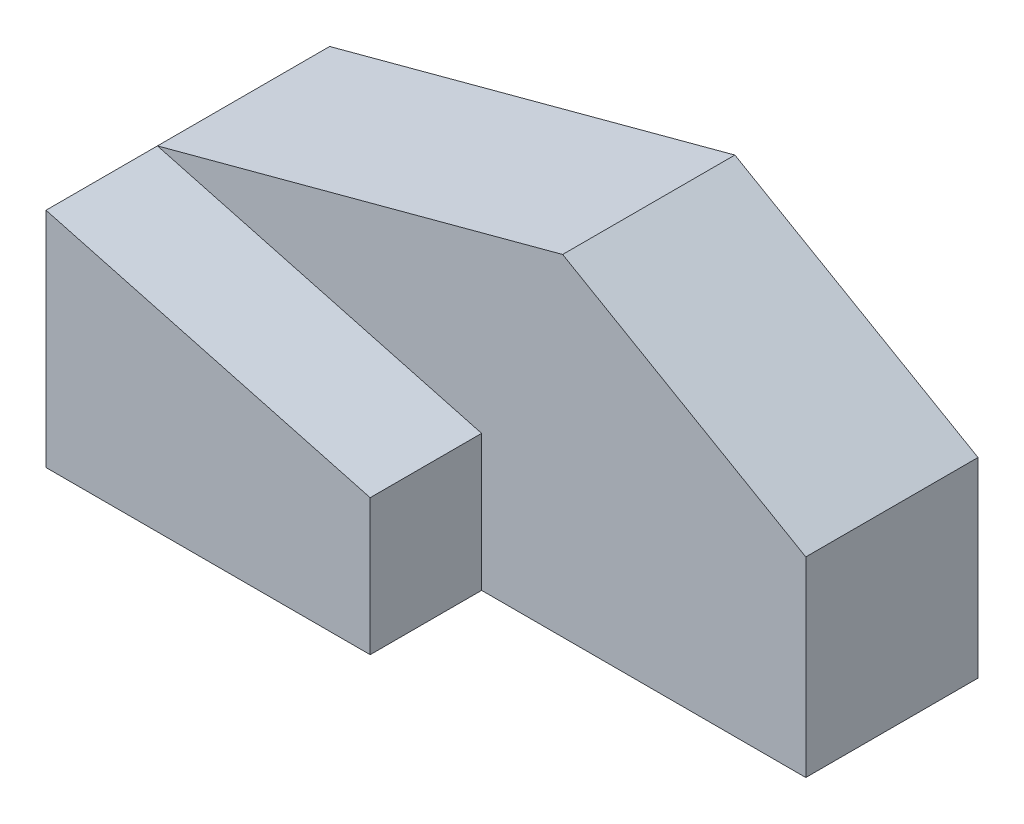
ISO-10303-21;
HEADER;
FILE_DESCRIPTION(('STEP AP214'),'2;1');
FILE_NAME('part.step','',(''),(''),'','','');
FILE_SCHEMA(('AUTOMOTIVE_DESIGN { 1 0 10303 214 1 1 1 1 }'));
ENDSEC;
DATA;
#1=APPLICATION_CONTEXT('core data for automotive mechanical design processes');
#2=APPLICATION_PROTOCOL_DEFINITION('international standard','automotive_design',2000,#1);
#3=PRODUCT_CONTEXT('',#1,'mechanical');
#4=PRODUCT('Part','Part','',(#3));
#5=PRODUCT_RELATED_PRODUCT_CATEGORY('part','',(#4));
#6=PRODUCT_DEFINITION_FORMATION('','',#4);
#7=PRODUCT_DEFINITION_CONTEXT('part definition',#1,'design');
#8=PRODUCT_DEFINITION('design','',#6,#7);
#9=PRODUCT_DEFINITION_SHAPE('','',#8);
#10=(LENGTH_UNIT() NAMED_UNIT(*) SI_UNIT(.MILLI.,.METRE.));
#11=(NAMED_UNIT(*) PLANE_ANGLE_UNIT() SI_UNIT($,.RADIAN.));
#12=(NAMED_UNIT(*) SI_UNIT($,.STERADIAN.) SOLID_ANGLE_UNIT());
#13=UNCERTAINTY_MEASURE_WITH_UNIT(LENGTH_MEASURE(1.E-05),#10,'distance_accuracy_value','');
#14=(GEOMETRIC_REPRESENTATION_CONTEXT(3) GLOBAL_UNCERTAINTY_ASSIGNED_CONTEXT((#13)) GLOBAL_UNIT_ASSIGNED_CONTEXT((#10,
#11,#12)) REPRESENTATION_CONTEXT('',''));
#15=CARTESIAN_POINT('',(0.,0.,0.));
#16=DIRECTION('',(0.,0.,1.));
#17=DIRECTION('',(1.,0.,0.));
#18=AXIS2_PLACEMENT_3D('',#15,#16,#17);
#19=CARTESIAN_POINT('',(0.,0.,17.));
#20=DIRECTION('',(0.,0.,-1.));
#21=DIRECTION('',(-1.,0.,0.));
#22=AXIS2_PLACEMENT_3D('',#19,#20,#21);
#23=PLANE('',#22);
#24=DIRECTION('',(-0.965925826289069,0.258819045102518,0.));
#25=VECTOR('',#24,1.);
#26=CARTESIAN_POINT('',(0.,22.,17.));
#27=LINE('',#26,#25);
#28=CARTESIAN_POINT('',(32.,13.4256258422042,17.));
#29=VERTEX_POINT('',#28);
#30=CARTESIAN_POINT('',(0.,22.,17.));
#31=VERTEX_POINT('',#30);
#32=EDGE_CURVE('E121',#29,#31,#27,.T.);
#33=ORIENTED_EDGE('',*,*,#32,.F.);
#34=DIRECTION('',(0.,1.,0.));
#35=VECTOR('',#34,1.);
#36=CARTESIAN_POINT('',(32.,13.4256258422042,17.));
#37=LINE('',#36,#35);
#38=CARTESIAN_POINT('',(32.,0.,17.));
#39=VERTEX_POINT('',#38);
#40=EDGE_CURVE('E47',#39,#29,#37,.T.);
#41=ORIENTED_EDGE('',*,*,#40,.F.);
#42=DIRECTION('',(1.,0.,0.));
#43=VECTOR('',#42,1.);
#44=CARTESIAN_POINT('',(64.,0.,17.));
#45=LINE('',#44,#43);
#46=CARTESIAN_POINT('',(64.,0.,17.));
#47=VERTEX_POINT('',#46);
#48=EDGE_CURVE('E83',#39,#47,#45,.T.);
#49=ORIENTED_EDGE('',*,*,#48,.T.);
#50=DIRECTION('',(0.,1.,0.));
#51=VECTOR('',#50,1.);
#52=CARTESIAN_POINT('',(64.,18.8615612366936,17.));
#53=LINE('',#52,#51);
#54=CARTESIAN_POINT('',(64.,18.8615612366936,17.));
#55=VERTEX_POINT('',#54);
#56=EDGE_CURVE('E135',#47,#55,#53,.T.);
#57=ORIENTED_EDGE('',*,*,#56,.T.);
#58=DIRECTION('',(-0.866025403784436,0.500000000000004,0.));
#59=VECTOR('',#58,1.);
#60=CARTESIAN_POINT('',(40.,32.7179676972448,17.));
#61=LINE('',#60,#59);
#62=CARTESIAN_POINT('',(40.,32.7179676972448,17.));
#63=VERTEX_POINT('',#62);
#64=EDGE_CURVE('E165',#55,#63,#61,.T.);
#65=ORIENTED_EDGE('',*,*,#64,.T.);
#66=DIRECTION('',(-0.965925826289069,-0.258819045102518,0.));
#67=VECTOR('',#66,1.);
#68=CARTESIAN_POINT('',(0.,22.,17.));
#69=LINE('',#68,#67);
#70=EDGE_CURVE('E54',#63,#31,#69,.T.);
#71=ORIENTED_EDGE('',*,*,#70,.T.);
#72=EDGE_LOOP('',(#33,#41,#49,#57,#65,#71));
#73=FACE_BOUND('',#72,.T.);
#74=ADVANCED_FACE('F30',(#73),#23,.F.);
#75=CARTESIAN_POINT('',(64.,0.,17.));
#76=DIRECTION('',(0.,1.,0.));
#77=DIRECTION('',(-1.,0.,0.));
#78=AXIS2_PLACEMENT_3D('',#75,#76,#77);
#79=PLANE('',#78);
#80=DIRECTION('',(1.,0.,0.));
#81=VECTOR('',#80,1.);
#82=CARTESIAN_POINT('',(64.,0.,0.));
#83=LINE('',#82,#81);
#84=CARTESIAN_POINT('',(0.,0.,0.));
#85=VERTEX_POINT('',#84);
#86=CARTESIAN_POINT('',(64.,0.,0.));
#87=VERTEX_POINT('',#86);
#88=EDGE_CURVE('E142',#85,#87,#83,.T.);
#89=ORIENTED_EDGE('',*,*,#88,.T.);
#90=DIRECTION('',(0.,0.,-1.));
#91=VECTOR('',#90,1.);
#92=CARTESIAN_POINT('',(64.,0.,17.));
#93=LINE('',#92,#91);
#94=EDGE_CURVE('E11',#47,#87,#93,.T.);
#95=ORIENTED_EDGE('',*,*,#94,.F.);
#96=ORIENTED_EDGE('',*,*,#48,.F.);
#97=DIRECTION('',(0.,0.,-1.));
#98=VECTOR('',#97,1.);
#99=CARTESIAN_POINT('',(32.,0.,28.));
#100=LINE('',#99,#98);
#101=CARTESIAN_POINT('',(32.,0.,28.));
#102=VERTEX_POINT('',#101);
#103=EDGE_CURVE('E112',#102,#39,#100,.T.);
#104=ORIENTED_EDGE('',*,*,#103,.F.);
#105=DIRECTION('',(1.,0.,0.));
#106=VECTOR('',#105,1.);
#107=CARTESIAN_POINT('',(0.,0.,28.));
#108=LINE('',#107,#106);
#109=CARTESIAN_POINT('',(0.,0.,28.));
#110=VERTEX_POINT('',#109);
#111=EDGE_CURVE('E110',#110,#102,#108,.T.);
#112=ORIENTED_EDGE('',*,*,#111,.F.);
#113=DIRECTION('',(0.,0.,-1.));
#114=VECTOR('',#113,1.);
#115=CARTESIAN_POINT('',(0.,0.,17.));
#116=LINE('',#115,#114);
#117=EDGE_CURVE('E98',#110,#85,#116,.T.);
#118=ORIENTED_EDGE('',*,*,#117,.T.);
#119=EDGE_LOOP('',(#89,#95,#96,#104,#112,#118));
#120=FACE_BOUND('',#119,.T.);
#121=ADVANCED_FACE('F32',(#120),#79,.F.);
#122=CARTESIAN_POINT('',(64.,18.8615612366936,17.));
#123=DIRECTION('',(-1.,0.,0.));
#124=DIRECTION('',(0.,0.,1.));
#125=AXIS2_PLACEMENT_3D('',#122,#123,#124);
#126=PLANE('',#125);
#127=DIRECTION('',(0.,1.,0.));
#128=VECTOR('',#127,1.);
#129=CARTESIAN_POINT('',(64.,18.8615612366936,0.));
#130=LINE('',#129,#128);
#131=CARTESIAN_POINT('',(64.,18.8615612366936,0.));
#132=VERTEX_POINT('',#131);
#133=EDGE_CURVE('E144',#87,#132,#130,.T.);
#134=ORIENTED_EDGE('',*,*,#133,.T.);
#135=DIRECTION('',(0.,0.,-1.));
#136=VECTOR('',#135,1.);
#137=CARTESIAN_POINT('',(64.,18.8615612366936,17.));
#138=LINE('',#137,#136);
#139=EDGE_CURVE('E39',#55,#132,#138,.T.);
#140=ORIENTED_EDGE('',*,*,#139,.F.);
#141=ORIENTED_EDGE('',*,*,#56,.F.);
#142=ORIENTED_EDGE('',*,*,#94,.T.);
#143=EDGE_LOOP('',(#134,#140,#141,#142));
#144=FACE_BOUND('',#143,.T.);
#145=ADVANCED_FACE('F189',(#144),#126,.F.);
#146=CARTESIAN_POINT('',(40.,32.7179676972448,17.));
#147=DIRECTION('',(-0.500000000000004,-0.866025403784436,0.));
#148=DIRECTION('',(0.866025403784436,-0.500000000000004,0.));
#149=AXIS2_PLACEMENT_3D('',#146,#147,#148);
#150=PLANE('',#149);
#151=DIRECTION('',(-0.866025403784436,0.500000000000004,0.));
#152=VECTOR('',#151,1.);
#153=CARTESIAN_POINT('',(40.,32.7179676972448,0.));
#154=LINE('',#153,#152);
#155=CARTESIAN_POINT('',(40.,32.7179676972448,0.));
#156=VERTEX_POINT('',#155);
#157=EDGE_CURVE('E147',#132,#156,#154,.T.);
#158=ORIENTED_EDGE('',*,*,#157,.T.);
#159=DIRECTION('',(0.,0.,-1.));
#160=VECTOR('',#159,1.);
#161=CARTESIAN_POINT('',(40.,32.7179676972448,17.));
#162=LINE('',#161,#160);
#163=EDGE_CURVE('E156',#63,#156,#162,.T.);
#164=ORIENTED_EDGE('',*,*,#163,.F.);
#165=ORIENTED_EDGE('',*,*,#64,.F.);
#166=ORIENTED_EDGE('',*,*,#139,.T.);
#167=EDGE_LOOP('',(#158,#164,#165,#166));
#168=FACE_BOUND('',#167,.T.);
#169=ADVANCED_FACE('F163',(#168),#150,.F.);
#170=CARTESIAN_POINT('',(0.,22.,17.));
#171=DIRECTION('',(0.258819045102518,-0.965925826289069,0.));
#172=DIRECTION('',(0.965925826289069,0.258819045102518,0.));
#173=AXIS2_PLACEMENT_3D('',#170,#171,#172);
#174=PLANE('',#173);
#175=DIRECTION('',(-0.965925826289069,-0.258819045102518,0.));
#176=VECTOR('',#175,1.);
#177=CARTESIAN_POINT('',(0.,22.,0.));
#178=LINE('',#177,#176);
#179=CARTESIAN_POINT('',(0.,22.,0.));
#180=VERTEX_POINT('',#179);
#181=EDGE_CURVE('E152',#156,#180,#178,.T.);
#182=ORIENTED_EDGE('',*,*,#181,.T.);
#183=DIRECTION('',(0.,0.,-1.));
#184=VECTOR('',#183,1.);
#185=CARTESIAN_POINT('',(0.,22.,17.));
#186=LINE('',#185,#184);
#187=EDGE_CURVE('E107',#31,#180,#186,.T.);
#188=ORIENTED_EDGE('',*,*,#187,.F.);
#189=ORIENTED_EDGE('',*,*,#70,.F.);
#190=ORIENTED_EDGE('',*,*,#163,.T.);
#191=EDGE_LOOP('',(#182,#188,#189,#190));
#192=FACE_BOUND('',#191,.T.);
#193=ADVANCED_FACE('F171',(#192),#174,.F.);
#194=CARTESIAN_POINT('',(0.,0.,17.));
#195=DIRECTION('',(1.,0.,0.));
#196=DIRECTION('',(0.,0.,-1.));
#197=AXIS2_PLACEMENT_3D('',#194,#195,#196);
#198=PLANE('',#197);
#199=DIRECTION('',(0.,-1.,0.));
#200=VECTOR('',#199,1.);
#201=CARTESIAN_POINT('',(0.,0.,0.));
#202=LINE('',#201,#200);
#203=EDGE_CURVE('E79',#180,#85,#202,.T.);
#204=ORIENTED_EDGE('',*,*,#203,.T.);
#205=ORIENTED_EDGE('',*,*,#117,.F.);
#206=DIRECTION('',(0.,-1.,0.));
#207=VECTOR('',#206,1.);
#208=CARTESIAN_POINT('',(0.,22.,28.));
#209=LINE('',#208,#207);
#210=CARTESIAN_POINT('',(0.,22.,28.));
#211=VERTEX_POINT('',#210);
#212=EDGE_CURVE('E103',#211,#110,#209,.T.);
#213=ORIENTED_EDGE('',*,*,#212,.F.);
#214=DIRECTION('',(0.,0.,-1.));
#215=VECTOR('',#214,1.);
#216=CARTESIAN_POINT('',(0.,22.,28.));
#217=LINE('',#216,#215);
#218=EDGE_CURVE('E127',#211,#31,#217,.T.);
#219=ORIENTED_EDGE('',*,*,#218,.T.);
#220=ORIENTED_EDGE('',*,*,#187,.T.);
#221=EDGE_LOOP('',(#204,#205,#213,#219,#220));
#222=FACE_BOUND('',#221,.T.);
#223=ADVANCED_FACE('F100',(#222),#198,.F.);
#224=CARTESIAN_POINT('',(0.,0.,0.));
#225=DIRECTION('',(0.,0.,-1.));
#226=DIRECTION('',(-1.,0.,0.));
#227=AXIS2_PLACEMENT_3D('',#224,#225,#226);
#228=PLANE('',#227);
#229=ORIENTED_EDGE('',*,*,#88,.F.);
#230=ORIENTED_EDGE('',*,*,#203,.F.);
#231=ORIENTED_EDGE('',*,*,#181,.F.);
#232=ORIENTED_EDGE('',*,*,#157,.F.);
#233=ORIENTED_EDGE('',*,*,#133,.F.);
#234=EDGE_LOOP('',(#229,#230,#231,#232,#233));
#235=FACE_BOUND('',#234,.T.);
#236=ADVANCED_FACE('F169',(#235),#228,.T.);
#237=CARTESIAN_POINT('',(32.,13.4256258422042,28.));
#238=DIRECTION('',(-1.,0.,0.));
#239=DIRECTION('',(0.,0.,1.));
#240=AXIS2_PLACEMENT_3D('',#237,#238,#239);
#241=PLANE('',#240);
#242=ORIENTED_EDGE('',*,*,#40,.T.);
#243=DIRECTION('',(0.,0.,-1.));
#244=VECTOR('',#243,1.);
#245=CARTESIAN_POINT('',(32.,13.4256258422042,28.));
#246=LINE('',#245,#244);
#247=CARTESIAN_POINT('',(32.,13.4256258422042,28.));
#248=VERTEX_POINT('',#247);
#249=EDGE_CURVE('E130',#248,#29,#246,.T.);
#250=ORIENTED_EDGE('',*,*,#249,.F.);
#251=DIRECTION('',(0.,1.,0.));
#252=VECTOR('',#251,1.);
#253=CARTESIAN_POINT('',(32.,13.4256258422042,28.));
#254=LINE('',#253,#252);
#255=EDGE_CURVE('E115',#102,#248,#254,.T.);
#256=ORIENTED_EDGE('',*,*,#255,.F.);
#257=ORIENTED_EDGE('',*,*,#103,.T.);
#258=EDGE_LOOP('',(#242,#250,#256,#257));
#259=FACE_BOUND('',#258,.T.);
#260=ADVANCED_FACE('F175',(#259),#241,.F.);
#261=CARTESIAN_POINT('',(0.,22.,28.));
#262=DIRECTION('',(-0.258819045102518,-0.965925826289069,0.));
#263=DIRECTION('',(0.965925826289069,-0.258819045102518,0.));
#264=AXIS2_PLACEMENT_3D('',#261,#262,#263);
#265=PLANE('',#264);
#266=ORIENTED_EDGE('',*,*,#32,.T.);
#267=ORIENTED_EDGE('',*,*,#218,.F.);
#268=DIRECTION('',(-0.965925826289069,0.258819045102518,0.));
#269=VECTOR('',#268,1.);
#270=CARTESIAN_POINT('',(0.,22.,28.));
#271=LINE('',#270,#269);
#272=EDGE_CURVE('E119',#248,#211,#271,.T.);
#273=ORIENTED_EDGE('',*,*,#272,.F.);
#274=ORIENTED_EDGE('',*,*,#249,.T.);
#275=EDGE_LOOP('',(#266,#267,#273,#274));
#276=FACE_BOUND('',#275,.T.);
#277=ADVANCED_FACE('F173',(#276),#265,.F.);
#278=CARTESIAN_POINT('',(0.,0.,28.));
#279=DIRECTION('',(0.,0.,1.));
#280=DIRECTION('',(1.,0.,0.));
#281=AXIS2_PLACEMENT_3D('',#278,#279,#280);
#282=PLANE('',#281);
#283=ORIENTED_EDGE('',*,*,#212,.T.);
#284=ORIENTED_EDGE('',*,*,#111,.T.);
#285=ORIENTED_EDGE('',*,*,#255,.T.);
#286=ORIENTED_EDGE('',*,*,#272,.T.);
#287=EDGE_LOOP('',(#283,#284,#285,#286));
#288=FACE_BOUND('',#287,.T.);
#289=ADVANCED_FACE('F117',(#288),#282,.T.);
#290=CLOSED_SHELL('',(#74,#121,#145,#169,#193,#223,#236,#260,#277,#289));
#291=MANIFOLD_SOLID_BREP('B2',#290);
#292=ADVANCED_BREP_SHAPE_REPRESENTATION('',(#18,#291),#14);
#293=SHAPE_DEFINITION_REPRESENTATION(#9,#292);
ENDSEC;
END-ISO-10303-21;
